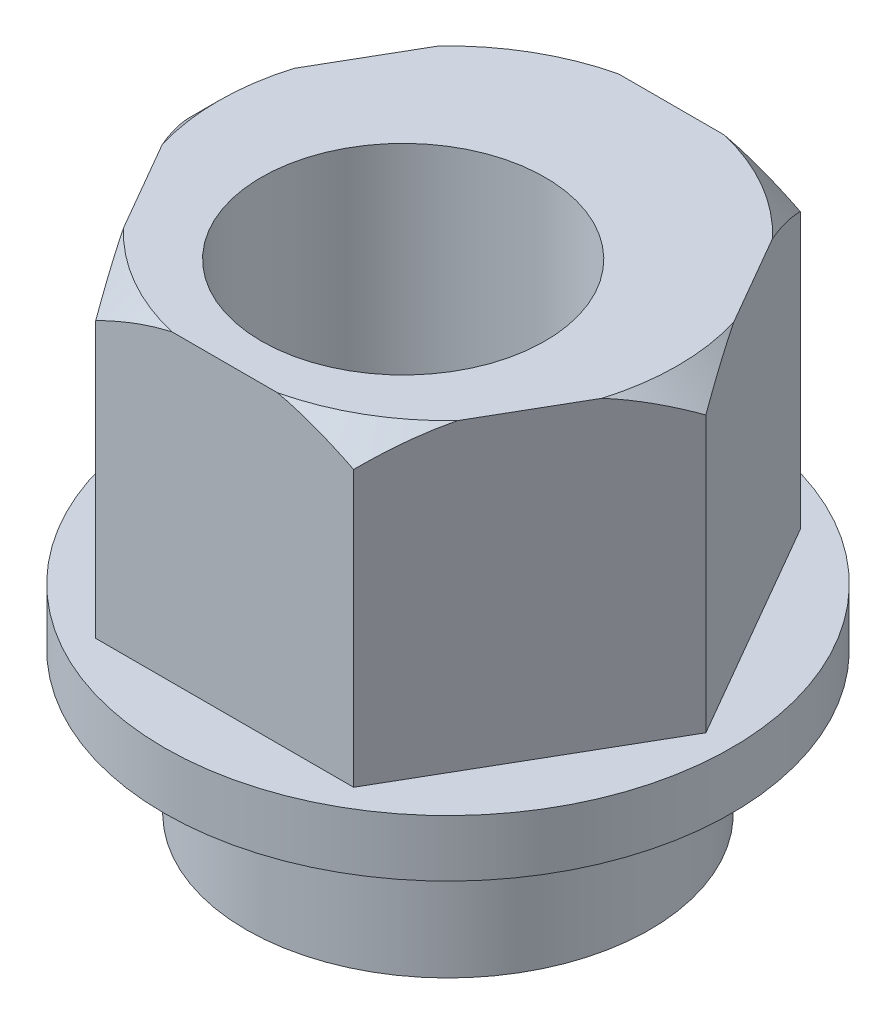
ISO-10303-21;
HEADER;
FILE_DESCRIPTION(('STEP AP214'),'2;1');
FILE_NAME('part.step','',(''),(''),'','','');
FILE_SCHEMA(('AUTOMOTIVE_DESIGN { 1 0 10303 214 1 1 1 1 }'));
ENDSEC;
DATA;
#1=APPLICATION_CONTEXT('core data for automotive mechanical design processes');
#2=APPLICATION_PROTOCOL_DEFINITION('international standard','automotive_design',2000,#1);
#3=PRODUCT_CONTEXT('',#1,'mechanical');
#4=PRODUCT('Part','Part','',(#3));
#5=PRODUCT_RELATED_PRODUCT_CATEGORY('part','',(#4));
#6=PRODUCT_DEFINITION_FORMATION('','',#4);
#7=PRODUCT_DEFINITION_CONTEXT('part definition',#1,'design');
#8=PRODUCT_DEFINITION('design','',#6,#7);
#9=PRODUCT_DEFINITION_SHAPE('','',#8);
#10=(LENGTH_UNIT() NAMED_UNIT(*) SI_UNIT(.MILLI.,.METRE.));
#11=(NAMED_UNIT(*) PLANE_ANGLE_UNIT() SI_UNIT($,.RADIAN.));
#12=(NAMED_UNIT(*) SI_UNIT($,.STERADIAN.) SOLID_ANGLE_UNIT());
#13=UNCERTAINTY_MEASURE_WITH_UNIT(LENGTH_MEASURE(1.E-05),#10,'distance_accuracy_value','');
#14=(GEOMETRIC_REPRESENTATION_CONTEXT(3) GLOBAL_UNCERTAINTY_ASSIGNED_CONTEXT((#13)) GLOBAL_UNIT_ASSIGNED_CONTEXT((#10,
#11,#12)) REPRESENTATION_CONTEXT('',''));
#15=CARTESIAN_POINT('',(0.,0.,0.));
#16=DIRECTION('',(0.,0.,1.));
#17=DIRECTION('',(1.,0.,0.));
#18=AXIS2_PLACEMENT_3D('',#15,#16,#17);
#19=CARTESIAN_POINT('',(0.,-1.,0.));
#20=DIRECTION('',(0.,1.,0.));
#21=DIRECTION('',(0.,0.,1.));
#22=AXIS2_PLACEMENT_3D('',#19,#20,#21);
#23=CYLINDRICAL_SURFACE('',#22,5.);
#24=CARTESIAN_POINT('',(0.,-1.,0.));
#25=DIRECTION('',(0.,1.,0.));
#26=DIRECTION('',(0.,0.,1.));
#27=AXIS2_PLACEMENT_3D('',#24,#25,#26);
#28=CIRCLE('',#27,5.);
#29=CARTESIAN_POINT('',(0.,-1.,5.));
#30=VERTEX_POINT('',#29);
#31=EDGE_CURVE('E162',#30,#30,#28,.T.);
#32=ORIENTED_EDGE('',*,*,#31,.T.);
#33=EDGE_LOOP('',(#32));
#34=FACE_BOUND('',#33,.T.);
#35=CARTESIAN_POINT('',(0.,0.,0.));
#36=DIRECTION('',(0.,1.,0.));
#37=DIRECTION('',(0.,0.,1.));
#38=AXIS2_PLACEMENT_3D('',#35,#36,#37);
#39=CIRCLE('',#38,5.);
#40=CARTESIAN_POINT('',(0.,0.,5.));
#41=VERTEX_POINT('',#40);
#42=EDGE_CURVE('E19',#41,#41,#39,.T.);
#43=ORIENTED_EDGE('',*,*,#42,.F.);
#44=EDGE_LOOP('',(#43));
#45=FACE_BOUND('',#44,.T.);
#46=ADVANCED_FACE('F16',(#34,#45),#23,.T.);
#47=CARTESIAN_POINT('',(0.,0.,0.));
#48=DIRECTION('',(0.,1.,0.));
#49=DIRECTION('',(0.,0.,1.));
#50=AXIS2_PLACEMENT_3D('',#47,#48,#49);
#51=PLANE('',#50);
#52=DIRECTION('',(-0.5,0.,0.866025403784439));
#53=VECTOR('',#52,1.);
#54=CARTESIAN_POINT('',(2.27187330926118,0.,3.935));
#55=LINE('',#54,#53);
#56=CARTESIAN_POINT('',(4.54374661852235,0.,0.));
#57=VERTEX_POINT('',#56);
#58=CARTESIAN_POINT('',(2.27187330926118,0.,3.935));
#59=VERTEX_POINT('',#58);
#60=EDGE_CURVE('E157',#57,#59,#55,.T.);
#61=ORIENTED_EDGE('',*,*,#60,.T.);
#62=DIRECTION('',(-1.,0.,0.));
#63=VECTOR('',#62,1.);
#64=CARTESIAN_POINT('',(-2.27187330926118,0.,3.935));
#65=LINE('',#64,#63);
#66=CARTESIAN_POINT('',(-2.27187330926118,0.,3.935));
#67=VERTEX_POINT('',#66);
#68=EDGE_CURVE('E110',#59,#67,#65,.T.);
#69=ORIENTED_EDGE('',*,*,#68,.T.);
#70=DIRECTION('',(-0.5,0.,-0.866025403784439));
#71=VECTOR('',#70,1.);
#72=CARTESIAN_POINT('',(-4.54374661852235,0.,0.));
#73=LINE('',#72,#71);
#74=CARTESIAN_POINT('',(-4.54374661852235,0.,0.));
#75=VERTEX_POINT('',#74);
#76=EDGE_CURVE('E130',#67,#75,#73,.T.);
#77=ORIENTED_EDGE('',*,*,#76,.T.);
#78=DIRECTION('',(0.5,0.,-0.866025403784439));
#79=VECTOR('',#78,1.);
#80=CARTESIAN_POINT('',(-2.27187330926118,0.,-3.935));
#81=LINE('',#80,#79);
#82=CARTESIAN_POINT('',(-2.27187330926118,0.,-3.935));
#83=VERTEX_POINT('',#82);
#84=EDGE_CURVE('E137',#75,#83,#81,.T.);
#85=ORIENTED_EDGE('',*,*,#84,.T.);
#86=DIRECTION('',(1.,0.,0.));
#87=VECTOR('',#86,1.);
#88=CARTESIAN_POINT('',(2.27187330926118,0.,-3.935));
#89=LINE('',#88,#87);
#90=CARTESIAN_POINT('',(2.27187330926118,0.,-3.935));
#91=VERTEX_POINT('',#90);
#92=EDGE_CURVE('E144',#83,#91,#89,.T.);
#93=ORIENTED_EDGE('',*,*,#92,.T.);
#94=DIRECTION('',(0.5,0.,0.866025403784438));
#95=VECTOR('',#94,1.);
#96=CARTESIAN_POINT('',(4.54374661852235,0.,0.));
#97=LINE('',#96,#95);
#98=EDGE_CURVE('E151',#91,#57,#97,.T.);
#99=ORIENTED_EDGE('',*,*,#98,.T.);
#100=EDGE_LOOP('',(#61,#69,#77,#85,#93,#99));
#101=FACE_BOUND('',#100,.T.);
#102=ORIENTED_EDGE('',*,*,#42,.T.);
#103=EDGE_LOOP('',(#102));
#104=FACE_BOUND('',#103,.T.);
#105=ADVANCED_FACE('F242',(#101,#104),#51,.T.);
#106=CARTESIAN_POINT('',(0.,-1.,0.));
#107=DIRECTION('',(0.,1.,0.));
#108=DIRECTION('',(0.,0.,1.));
#109=AXIS2_PLACEMENT_3D('',#106,#107,#108);
#110=PLANE('',#109);
#111=CARTESIAN_POINT('',(0.,-1.,0.));
#112=DIRECTION('',(0.,1.,0.));
#113=DIRECTION('',(0.,0.,1.));
#114=AXIS2_PLACEMENT_3D('',#111,#112,#113);
#115=CIRCLE('',#114,3.555);
#116=CARTESIAN_POINT('',(0.,-1.,3.555));
#117=VERTEX_POINT('',#116);
#118=EDGE_CURVE('E106',#117,#117,#115,.F.);
#119=ORIENTED_EDGE('',*,*,#118,.F.);
#120=EDGE_LOOP('',(#119));
#121=FACE_BOUND('',#120,.T.);
#122=ORIENTED_EDGE('',*,*,#31,.F.);
#123=EDGE_LOOP('',(#122));
#124=FACE_BOUND('',#123,.T.);
#125=ADVANCED_FACE('F224',(#121,#124),#110,.F.);
#126=CARTESIAN_POINT('',(0.,4.84699999998384,0.));
#127=DIRECTION('',(0.,-1.,0.));
#128=DIRECTION('',(0.,0.,-1.));
#129=AXIS2_PLACEMENT_3D('',#126,#127,#128);
#130=CONICAL_SURFACE('',#129,4.54674661853005,0.785398163397448);
#131=CARTESIAN_POINT('',(0.,5.35000000002128,0.));
#132=DIRECTION('',(0.,-1.,0.));
#133=DIRECTION('',(0.,0.,-1.));
#134=AXIS2_PLACEMENT_3D('',#131,#132,#133);
#135=CIRCLE('',#134,4.04374661849261);
#136=CARTESIAN_POINT('',(-2.94206815916331,5.35000000000688,2.77418846899851));
#137=VERTEX_POINT('',#136);
#138=CARTESIAN_POINT('',(-0.931483609456905,5.35000000000688,3.935));
#139=VERTEX_POINT('',#138);
#140=EDGE_CURVE('E100',#137,#139,#135,.F.);
#141=ORIENTED_EDGE('',*,*,#140,.F.);
#142=CARTESIAN_POINT('',(-2.94206815913204,5.34999999999247,2.77418846905266));
#143=CARTESIAN_POINT('',(-2.88369490561732,5.32311726281172,2.87529390994326));
#144=CARTESIAN_POINT('',(-2.82588978554609,5.2916876515457,2.97541531484424));
#145=CARTESIAN_POINT('',(-2.71168345432735,5.22111447069021,3.17322648306114));
#146=CARTESIAN_POINT('',(-2.65527804162325,5.1819982531219,3.27092352368655));
#147=CARTESIAN_POINT('',(-2.54376759125181,5.09725486990143,3.46406528930476));
#148=CARTESIAN_POINT('',(-2.48866169605256,5.05163214634154,3.55951149958642));
#149=CARTESIAN_POINT('',(-2.37946542423053,4.95475562364142,3.74864499037929));
#150=CARTESIAN_POINT('',(-2.32537928508143,4.90348264387568,3.84232493137076));
#151=CARTESIAN_POINT('',(-2.27187330926287,4.84999999999323,3.93499999999707));
#152=B_SPLINE_CURVE_WITH_KNOTS('',3,(#142,#143,#144,#145,#146,#147,#148,#149,#150,#151),
.UNSPECIFIED.,.F.,.F.,(4,2,2,2,4),(0.,0.359189297663674,0.717122874537991,1.07481324414615,
1.43375760013528),.UNSPECIFIED.);
#153=CARTESIAN_POINT('',(-2.27187330925948,4.84999999999238,3.935));
#154=VERTEX_POINT('',#153);
#155=EDGE_CURVE('E97',#137,#154,#152,.T.);
#156=ORIENTED_EDGE('',*,*,#155,.T.);
#157=CARTESIAN_POINT('',(-2.27187330925779,4.84999999999323,3.935));
#158=CARTESIAN_POINT('',(-2.16486135762066,4.90348264387568,3.935));
#159=CARTESIAN_POINT('',(-2.05668907932247,4.95475562364142,3.935));
#160=CARTESIAN_POINT('',(-1.8382965356784,5.05163214634154,3.935));
#161=CARTESIAN_POINT('',(-1.7280847452799,5.09725486990143,3.935));
#162=CARTESIAN_POINT('',(-1.50506384453703,5.1819982531219,3.935));
#163=CARTESIAN_POINT('',(-1.39225301912881,5.22111447069021,3.935));
#164=CARTESIAN_POINT('',(-1.16384035669133,5.2916876515457,3.935));
#165=CARTESIAN_POINT('',(-1.04823011654888,5.32311726281172,3.935));
#166=CARTESIAN_POINT('',(-0.931483609519434,5.34999999999247,3.935));
#167=B_SPLINE_CURVE_WITH_KNOTS('',3,(#157,#158,#159,#160,#161,#162,#163,#164,#165,#166),
.UNSPECIFIED.,.F.,.F.,(4,2,2,2,4),(0.,0.358944355989134,0.716634725597295,1.07456830247162,
1.43375760013529),.UNSPECIFIED.);
#168=EDGE_CURVE('E91',#154,#139,#167,.T.);
#169=ORIENTED_EDGE('',*,*,#168,.T.);
#170=EDGE_LOOP('',(#141,#156,#169));
#171=FACE_BOUND('',#170,.T.);
#172=ADVANCED_FACE('F108',(#171),#130,.T.);
#173=CARTESIAN_POINT('',(-2.27187330926118,5.35,3.935));
#174=DIRECTION('',(0.,0.,-1.));
#175=DIRECTION('',(-1.,0.,0.));
#176=AXIS2_PLACEMENT_3D('',#173,#174,#175);
#177=PLANE('',#176);
#178=CARTESIAN_POINT('',(0.931483609519689,5.34999999999242,3.935));
#179=CARTESIAN_POINT('',(1.04823011008447,5.32311726430012,3.935));
#180=CARTESIAN_POINT('',(1.16384034389687,5.29168765502345,3.935));
#181=CARTESIAN_POINT('',(1.39225299400288,5.22111447892625,3.935));
#182=CARTESIAN_POINT('',(1.50506381340808,5.18199826412198,3.935));
#183=CARTESIAN_POINT('',(1.72808470243914,5.09725488700998,3.935));
#184=CARTESIAN_POINT('',(1.8382964871284,5.0516321667935,3.935));
#185=CARTESIAN_POINT('',(2.0566890195489,4.95475565123795,3.935));
#186=CARTESIAN_POINT('',(2.16486129233428,4.90348267527638,3.935));
#187=CARTESIAN_POINT('',(2.27187323856476,4.85000003533974,3.935));
#188=B_SPLINE_CURVE_WITH_KNOTS('',3,(#178,#179,#180,#181,#182,#183,#184,#185,#186,#187),
.UNSPECIFIED.,.F.,.F.,(4,2,2,2,4),(0.,0.35918927780418,0.717122834985752,1.07481318494925,
1.43375752112754),.UNSPECIFIED.);
#189=CARTESIAN_POINT('',(0.931483609457033,5.35000000000685,3.935));
#190=VERTEX_POINT('',#189);
#191=CARTESIAN_POINT('',(2.27187327037482,4.85000001412749,3.93500000612825));
#192=VERTEX_POINT('',#191);
#193=EDGE_CURVE('E109',#190,#192,#188,.T.);
#194=ORIENTED_EDGE('',*,*,#193,.F.);
#195=DIRECTION('',(1.,0.,0.));
#196=VECTOR('',#195,1.);
#197=CARTESIAN_POINT('',(0.,5.35,3.935));
#198=LINE('',#197,#196);
#199=EDGE_CURVE('E102',#139,#190,#198,.T.);
#200=ORIENTED_EDGE('',*,*,#199,.F.);
#201=ORIENTED_EDGE('',*,*,#168,.F.);
#202=DIRECTION('',(0.,1.,0.));
#203=VECTOR('',#202,1.);
#204=CARTESIAN_POINT('',(-2.27187330926118,5.35,3.935));
#205=LINE('',#204,#203);
#206=EDGE_CURVE('E122',#154,#67,#205,.F.);
#207=ORIENTED_EDGE('',*,*,#206,.T.);
#208=ORIENTED_EDGE('',*,*,#68,.F.);
#209=DIRECTION('',(0.,1.,0.));
#210=VECTOR('',#209,1.);
#211=CARTESIAN_POINT('',(2.27187330926118,5.35,3.935));
#212=LINE('',#211,#210);
#213=EDGE_CURVE('E154',#59,#192,#212,.T.);
#214=ORIENTED_EDGE('',*,*,#213,.T.);
#215=EDGE_LOOP('',(#194,#200,#201,#207,#208,#214));
#216=FACE_BOUND('',#215,.T.);
#217=ADVANCED_FACE('F112',(#216),#177,.F.);
#218=CARTESIAN_POINT('',(0.,4.84699999998384,0.));
#219=DIRECTION('',(0.,-1.,0.));
#220=DIRECTION('',(0.,0.,-1.));
#221=AXIS2_PLACEMENT_3D('',#218,#219,#220);
#222=CONICAL_SURFACE('',#221,4.54674661853005,0.785398163397448);
#223=ORIENTED_EDGE('',*,*,#193,.T.);
#224=CARTESIAN_POINT('',(2.2718732790331,4.84999997949193,3.93499999113987));
#225=CARTESIAN_POINT('',(2.32537927035253,4.90348263289783,3.84232493481008));
#226=CARTESIAN_POINT('',(2.37946541625714,4.95475561705231,3.74864499825653));
#227=CARTESIAN_POINT('',(2.48866169377995,5.05163214384352,3.55951150943506));
#228=CARTESIAN_POINT('',(2.54376758795018,5.09725486712772,3.46406529671352));
#229=CARTESIAN_POINT('',(2.65527803812399,5.18199825072697,3.27092352805614));
#230=CARTESIAN_POINT('',(2.71168345165866,5.2211144689616,3.17322648683633));
#231=CARTESIAN_POINT('',(2.82588978463963,5.2916876510655,2.97541531726439));
#232=CARTESIAN_POINT('',(2.88369490564415,5.32311726290318,2.87529391159999));
#233=CARTESIAN_POINT('',(2.94206815913205,5.34999999999247,2.77418846905266));
#234=B_SPLINE_CURVE_WITH_KNOTS('',3,(#224,#225,#226,#227,#228,#229,#230,#231,#232,#233),
.UNSPECIFIED.,.F.,.F.,(4,2,2,2,4),(0.,0.358944360344127,0.716634733911905,1.07456831413734,
1.4337576156195),.UNSPECIFIED.);
#235=CARTESIAN_POINT('',(2.94206815916332,5.35000000000688,2.7741884689985));
#236=VERTEX_POINT('',#235);
#237=EDGE_CURVE('E156',#192,#236,#234,.T.);
#238=ORIENTED_EDGE('',*,*,#237,.T.);
#239=CARTESIAN_POINT('',(0.,5.35000000002128,0.));
#240=DIRECTION('',(0.,-1.,0.));
#241=DIRECTION('',(0.,0.,-1.));
#242=AXIS2_PLACEMENT_3D('',#239,#240,#241);
#243=CIRCLE('',#242,4.04374661849261);
#244=EDGE_CURVE('E115',#190,#236,#243,.F.);
#245=ORIENTED_EDGE('',*,*,#244,.F.);
#246=EDGE_LOOP('',(#223,#238,#245));
#247=FACE_BOUND('',#246,.T.);
#248=ADVANCED_FACE('F294',(#247),#222,.T.);
#249=CARTESIAN_POINT('',(2.27187330926118,5.35,3.935));
#250=DIRECTION('',(-0.866025403784439,0.,-0.5));
#251=DIRECTION('',(-0.5,0.,0.866025403784439));
#252=AXIS2_PLACEMENT_3D('',#249,#250,#251);
#253=PLANE('',#252);
#254=CARTESIAN_POINT('',(3.87355176865162,5.34999999999241,1.16081153094712));
#255=CARTESIAN_POINT('',(3.93192502216647,5.32311726281159,1.05970609005629));
#256=CARTESIAN_POINT('',(3.98973014223782,5.29168765154549,0.959584685155089));
#257=CARTESIAN_POINT('',(4.10393647345682,5.22111447068978,0.761773516937757));
#258=CARTESIAN_POINT('',(4.16034188616104,5.18199825312136,0.664076476312141));
#259=CARTESIAN_POINT('',(4.27185233653272,5.09725486990063,0.470934710693513));
#260=CARTESIAN_POINT('',(4.32695823173208,5.0516321463406,0.375488500411652));
#261=CARTESIAN_POINT('',(4.43615450355434,4.95475562364018,0.186355009618393));
#262=CARTESIAN_POINT('',(4.49024064270355,4.90348264387428,0.0926750686267245));
#263=CARTESIAN_POINT('',(4.54374661852222,4.84999999999166,2.30510402294371E-13));
#264=B_SPLINE_CURVE_WITH_KNOTS('',3,(#254,#255,#256,#257,#258,#259,#260,#261,#262,#263),
.UNSPECIFIED.,.F.,.F.,(4,2,2,2,4),(0.,0.359189297664486,0.717122874539609,1.07481324414857,
1.43375760013851),.UNSPECIFIED.);
#265=CARTESIAN_POINT('',(3.87355176862029,5.35000000000685,1.16081153100138));
#266=VERTEX_POINT('',#265);
#267=CARTESIAN_POINT('',(4.54374661852222,4.84999999999167,0.));
#268=VERTEX_POINT('',#267);
#269=EDGE_CURVE('E182',#266,#268,#264,.T.);
#270=ORIENTED_EDGE('',*,*,#269,.F.);
#271=DIRECTION('',(0.500000000000001,0.,-0.866025403784438));
#272=VECTOR('',#271,1.);
#273=CARTESIAN_POINT('',(2.94206815913,5.35,2.7741884690562));
#274=LINE('',#273,#272);
#275=EDGE_CURVE('E117',#236,#266,#274,.T.);
#276=ORIENTED_EDGE('',*,*,#275,.F.);
#277=ORIENTED_EDGE('',*,*,#237,.F.);
#278=ORIENTED_EDGE('',*,*,#213,.F.);
#279=ORIENTED_EDGE('',*,*,#60,.F.);
#280=DIRECTION('',(0.,1.,0.));
#281=VECTOR('',#280,1.);
#282=CARTESIAN_POINT('',(4.54374661852235,5.35,0.));
#283=LINE('',#282,#281);
#284=EDGE_CURVE('E147',#57,#268,#283,.T.);
#285=ORIENTED_EDGE('',*,*,#284,.T.);
#286=EDGE_LOOP('',(#270,#276,#277,#278,#279,#285));
#287=FACE_BOUND('',#286,.T.);
#288=ADVANCED_FACE('F300',(#287),#253,.F.);
#289=CARTESIAN_POINT('',(0.,4.84699999998384,0.));
#290=DIRECTION('',(0.,-1.,0.));
#291=DIRECTION('',(0.,0.,-1.));
#292=AXIS2_PLACEMENT_3D('',#289,#290,#291);
#293=CONICAL_SURFACE('',#292,4.54674661853005,0.785398163397448);
#294=CARTESIAN_POINT('',(0.,5.35000000002128,0.));
#295=DIRECTION('',(0.,-1.,0.));
#296=DIRECTION('',(0.,0.,-1.));
#297=AXIS2_PLACEMENT_3D('',#294,#295,#296);
#298=CIRCLE('',#297,4.04374661849261);
#299=CARTESIAN_POINT('',(3.87355176862022,5.35000000000688,-1.16081153100149));
#300=VERTEX_POINT('',#299);
#301=EDGE_CURVE('E202',#266,#300,#298,.F.);
#302=ORIENTED_EDGE('',*,*,#301,.F.);
#303=ORIENTED_EDGE('',*,*,#269,.T.);
#304=CARTESIAN_POINT('',(4.54374661852222,4.84999999999167,-2.30220451588973E-13));
#305=CARTESIAN_POINT('',(4.49024064270353,4.90348264387429,-0.0926750686267402));
#306=CARTESIAN_POINT('',(4.43615450355432,4.95475562364021,-0.186355009618426));
#307=CARTESIAN_POINT('',(4.32695823173203,5.05163214634064,-0.37548850041172));
#308=CARTESIAN_POINT('',(4.27185233653266,5.09725486990067,-0.470934710693599));
#309=CARTESIAN_POINT('',(4.16034188616097,5.18199825312141,-0.664076476312263));
#310=CARTESIAN_POINT('',(4.10393647345673,5.22111447068984,-0.761773516937897));
#311=CARTESIAN_POINT('',(3.98973014223772,5.29168765154555,-0.959584685155266));
#312=CARTESIAN_POINT('',(3.93192502216635,5.32311726281165,-1.05970609005649));
#313=CARTESIAN_POINT('',(3.87355176865149,5.34999999999248,-1.16081153094734));
#314=B_SPLINE_CURVE_WITH_KNOTS('',3,(#304,#305,#306,#307,#308,#309,#310,#311,#312,#313),
.UNSPECIFIED.,.F.,.F.,(4,2,2,2,4),(0.,0.358944355990006,0.716634725599032,1.07456830247422,
1.43375760013877),.UNSPECIFIED.);
#315=EDGE_CURVE('E150',#268,#300,#314,.T.);
#316=ORIENTED_EDGE('',*,*,#315,.T.);
#317=EDGE_LOOP('',(#302,#303,#316));
#318=FACE_BOUND('',#317,.T.);
#319=ADVANCED_FACE('F307',(#318),#293,.T.);
#320=CARTESIAN_POINT('',(4.54374661852235,5.35,0.));
#321=DIRECTION('',(-0.866025403784438,0.,0.5));
#322=DIRECTION('',(0.5,0.,0.866025403784438));
#323=AXIS2_PLACEMENT_3D('',#320,#321,#322);
#324=PLANE('',#323);
#325=CARTESIAN_POINT('',(2.94206815913191,5.34999999999242,-2.77418846905288));
#326=CARTESIAN_POINT('',(2.88369490561706,5.32311726281159,-2.87529390994371));
#327=CARTESIAN_POINT('',(2.8258897855457,5.29168765154549,-2.97541531484491));
#328=CARTESIAN_POINT('',(2.71168345432671,5.22111447068979,-3.17322648306224));
#329=CARTESIAN_POINT('',(2.65527804162249,5.18199825312136,-3.27092352368786));
#330=CARTESIAN_POINT('',(2.54376759125081,5.09725486990063,-3.46406528930649));
#331=CARTESIAN_POINT('',(2.48866169605145,5.0516321463406,-3.55951149958835));
#332=CARTESIAN_POINT('',(2.37946542422919,4.95475562364019,-3.74864499038161));
#333=CARTESIAN_POINT('',(2.32537928507998,4.90348264387428,-3.84232493137327));
#334=CARTESIAN_POINT('',(2.27187330926131,4.84999999999167,-3.93499999999977));
#335=B_SPLINE_CURVE_WITH_KNOTS('',3,(#325,#326,#327,#328,#329,#330,#331,#332,#333,#334),
.UNSPECIFIED.,.F.,.F.,(4,2,2,2,4),(0.,0.359189297664486,0.717122874539608,1.07481324414857,
1.43375760013851),.UNSPECIFIED.);
#336=CARTESIAN_POINT('',(2.94206815916324,5.35000000000685,-2.77418846899862));
#337=VERTEX_POINT('',#336);
#338=CARTESIAN_POINT('',(2.27187330926111,4.84999999999167,-3.93499999999988));
#339=VERTEX_POINT('',#338);
#340=EDGE_CURVE('E177',#337,#339,#335,.T.);
#341=ORIENTED_EDGE('',*,*,#340,.F.);
#342=DIRECTION('',(-0.500000000000001,0.,-0.866025403784438));
#343=VECTOR('',#342,1.);
#344=CARTESIAN_POINT('',(3.87355176865353,5.35,-1.1608115309438));
#345=LINE('',#344,#343);
#346=EDGE_CURVE('E201',#300,#337,#345,.T.);
#347=ORIENTED_EDGE('',*,*,#346,.F.);
#348=ORIENTED_EDGE('',*,*,#315,.F.);
#349=ORIENTED_EDGE('',*,*,#284,.F.);
#350=ORIENTED_EDGE('',*,*,#98,.F.);
#351=DIRECTION('',(0.,1.,0.));
#352=VECTOR('',#351,1.);
#353=CARTESIAN_POINT('',(2.27187330926118,5.35,-3.935));
#354=LINE('',#353,#352);
#355=EDGE_CURVE('E140',#91,#339,#354,.T.);
#356=ORIENTED_EDGE('',*,*,#355,.T.);
#357=EDGE_LOOP('',(#341,#347,#348,#349,#350,#356));
#358=FACE_BOUND('',#357,.T.);
#359=ADVANCED_FACE('F315',(#358),#324,.F.);
#360=CARTESIAN_POINT('',(0.,4.84699999998384,0.));
#361=DIRECTION('',(0.,-1.,0.));
#362=DIRECTION('',(0.,0.,-1.));
#363=AXIS2_PLACEMENT_3D('',#360,#361,#362);
#364=CONICAL_SURFACE('',#363,4.54674661853005,0.785398163397448);
#365=CARTESIAN_POINT('',(0.,5.35000000002128,0.));
#366=DIRECTION('',(0.,-1.,0.));
#367=DIRECTION('',(0.,0.,-1.));
#368=AXIS2_PLACEMENT_3D('',#365,#366,#367);
#369=CIRCLE('',#368,4.04374661849261);
#370=CARTESIAN_POINT('',(0.931483609456909,5.35000000000688,-3.935));
#371=VERTEX_POINT('',#370);
#372=EDGE_CURVE('E199',#337,#371,#369,.F.);
#373=ORIENTED_EDGE('',*,*,#372,.F.);
#374=ORIENTED_EDGE('',*,*,#340,.T.);
#375=CARTESIAN_POINT('',(2.27187330926091,4.84999999999167,-3.935));
#376=CARTESIAN_POINT('',(2.16486135762355,4.90348264387429,-3.935));
#377=CARTESIAN_POINT('',(2.05668907932511,4.9547556236402,-3.935));
#378=CARTESIAN_POINT('',(1.83829653568055,5.05163214634063,-3.935));
#379=CARTESIAN_POINT('',(1.7280847452818,5.09725486990067,-3.935));
#380=CARTESIAN_POINT('',(1.50506384453841,5.18199825312141,-3.935));
#381=CARTESIAN_POINT('',(1.39225301912993,5.22111447068984,-3.935));
#382=CARTESIAN_POINT('',(1.1638403566919,5.29168765154555,-3.935));
#383=CARTESIAN_POINT('',(1.04823011654917,5.32311726281165,-3.935));
#384=CARTESIAN_POINT('',(0.931483609519441,5.34999999999247,-3.935));
#385=B_SPLINE_CURVE_WITH_KNOTS('',3,(#375,#376,#377,#378,#379,#380,#381,#382,#383,#384),
.UNSPECIFIED.,.F.,.F.,(4,2,2,2,4),(0.,0.358944355990007,0.716634725599035,1.07456830247422,
1.43375760013878),.UNSPECIFIED.);
#386=EDGE_CURVE('E143',#339,#371,#385,.T.);
#387=ORIENTED_EDGE('',*,*,#386,.T.);
#388=EDGE_LOOP('',(#373,#374,#387));
#389=FACE_BOUND('',#388,.T.);
#390=ADVANCED_FACE('F323',(#389),#364,.T.);
#391=CARTESIAN_POINT('',(2.27187330926118,5.35,-3.935));
#392=DIRECTION('',(0.,0.,1.));
#393=DIRECTION('',(1.,0.,0.));
#394=AXIS2_PLACEMENT_3D('',#391,#392,#393);
#395=PLANE('',#394);
#396=CARTESIAN_POINT('',(-0.931483609519697,5.34999999999242,-3.935));
#397=CARTESIAN_POINT('',(-1.04823011654941,5.32311726281159,-3.935));
#398=CARTESIAN_POINT('',(-1.16384035669211,5.29168765154549,-3.935));
#399=CARTESIAN_POINT('',(-1.39225301913009,5.22111447068978,-3.935));
#400=CARTESIAN_POINT('',(-1.50506384453855,5.18199825312136,-3.935));
#401=CARTESIAN_POINT('',(-1.7280847452819,5.09725486990063,-3.935));
#402=CARTESIAN_POINT('',(-1.83829653568063,5.0516321463406,-3.935));
#403=CARTESIAN_POINT('',(-2.05668907932515,4.95475562364018,-3.935));
#404=CARTESIAN_POINT('',(-2.16486135762357,4.90348264387428,-3.935));
#405=CARTESIAN_POINT('',(-2.27187330926091,4.84999999999166,-3.935));
#406=B_SPLINE_CURVE_WITH_KNOTS('',3,(#396,#397,#398,#399,#400,#401,#402,#403,#404,#405),
.UNSPECIFIED.,.F.,.F.,(4,2,2,2,4),(0.,0.359189297664487,0.71712287453961,1.07481324414857,
1.43375760013852),.UNSPECIFIED.);
#407=CARTESIAN_POINT('',(-0.931483609457037,5.35000000000685,-3.935));
#408=VERTEX_POINT('',#407);
#409=CARTESIAN_POINT('',(-2.27187330926111,4.84999999999166,-3.93499999999988));
#410=VERTEX_POINT('',#409);
#411=EDGE_CURVE('E172',#408,#410,#406,.T.);
#412=ORIENTED_EDGE('',*,*,#411,.F.);
#413=DIRECTION('',(1.,0.,0.));
#414=VECTOR('',#413,1.);
#415=CARTESIAN_POINT('',(0.,5.35,-3.935));
#416=LINE('',#415,#414);
#417=EDGE_CURVE('E198',#371,#408,#416,.F.);
#418=ORIENTED_EDGE('',*,*,#417,.F.);
#419=ORIENTED_EDGE('',*,*,#386,.F.);
#420=ORIENTED_EDGE('',*,*,#355,.F.);
#421=ORIENTED_EDGE('',*,*,#92,.F.);
#422=DIRECTION('',(0.,1.,0.));
#423=VECTOR('',#422,1.);
#424=CARTESIAN_POINT('',(-2.27187330926118,5.35,-3.935));
#425=LINE('',#424,#423);
#426=EDGE_CURVE('E133',#83,#410,#425,.T.);
#427=ORIENTED_EDGE('',*,*,#426,.T.);
#428=EDGE_LOOP('',(#412,#418,#419,#420,#421,#427));
#429=FACE_BOUND('',#428,.T.);
#430=ADVANCED_FACE('F331',(#429),#395,.F.);
#431=CARTESIAN_POINT('',(0.,4.84699999998384,0.));
#432=DIRECTION('',(0.,-1.,0.));
#433=DIRECTION('',(0.,0.,-1.));
#434=AXIS2_PLACEMENT_3D('',#431,#432,#433);
#435=CONICAL_SURFACE('',#434,4.54674661853005,0.785398163397448);
#436=CARTESIAN_POINT('',(0.,5.35000000002128,0.));
#437=DIRECTION('',(0.,-1.,0.));
#438=DIRECTION('',(0.,0.,-1.));
#439=AXIS2_PLACEMENT_3D('',#436,#437,#438);
#440=CIRCLE('',#439,4.04374661849261);
#441=CARTESIAN_POINT('',(-2.94206815916332,5.35000000000688,-2.7741884689985));
#442=VERTEX_POINT('',#441);
#443=EDGE_CURVE('E196',#408,#442,#440,.F.);
#444=ORIENTED_EDGE('',*,*,#443,.F.);
#445=ORIENTED_EDGE('',*,*,#411,.T.);
#446=CARTESIAN_POINT('',(-2.27187330926131,4.84999999999166,-3.93499999999977));
#447=CARTESIAN_POINT('',(-2.32537928508,4.90348264387429,-3.84232493137326));
#448=CARTESIAN_POINT('',(-2.37946542422921,4.9547556236402,-3.74864499038157));
#449=CARTESIAN_POINT('',(-2.4886616960515,5.05163214634063,-3.55951149958828));
#450=CARTESIAN_POINT('',(-2.54376759125087,5.09725486990067,-3.4640652893064));
#451=CARTESIAN_POINT('',(-2.65527804162256,5.18199825312141,-3.27092352368774));
#452=CARTESIAN_POINT('',(-2.7116834543268,5.22111447068984,-3.1732264830621));
#453=CARTESIAN_POINT('',(-2.82588978554582,5.29168765154555,-2.97541531484473));
#454=CARTESIAN_POINT('',(-2.88369490561718,5.32311726281165,-2.87529390994351));
#455=CARTESIAN_POINT('',(-2.94206815913205,5.34999999999247,-2.77418846905266));
#456=B_SPLINE_CURVE_WITH_KNOTS('',3,(#446,#447,#448,#449,#450,#451,#452,#453,#454,#455),
.UNSPECIFIED.,.F.,.F.,(4,2,2,2,4),(0.,0.358944355990006,0.716634725599032,1.07456830247422,
1.43375760013877),.UNSPECIFIED.);
#457=EDGE_CURVE('E136',#410,#442,#456,.T.);
#458=ORIENTED_EDGE('',*,*,#457,.T.);
#459=EDGE_LOOP('',(#444,#445,#458));
#460=FACE_BOUND('',#459,.T.);
#461=ADVANCED_FACE('F339',(#460),#435,.T.);
#462=CARTESIAN_POINT('',(-2.27187330926118,5.35,-3.935));
#463=DIRECTION('',(0.866025403784439,0.,0.5));
#464=DIRECTION('',(0.5,0.,-0.866025403784439));
#465=AXIS2_PLACEMENT_3D('',#462,#463,#464);
#466=PLANE('',#465);
#467=CARTESIAN_POINT('',(-3.87355176865162,5.34999999999241,-1.16081153094712));
#468=CARTESIAN_POINT('',(-3.93192502216647,5.32311726281159,-1.05970609005629));
#469=CARTESIAN_POINT('',(-3.98973014223782,5.29168765154549,-0.959584685155089));
#470=CARTESIAN_POINT('',(-4.10393647345682,5.22111447068978,-0.761773516937757));
#471=CARTESIAN_POINT('',(-4.16034188616104,5.18199825312136,-0.664076476312142));
#472=CARTESIAN_POINT('',(-4.27185233653272,5.09725486990063,-0.470934710693514));
#473=CARTESIAN_POINT('',(-4.32695823173208,5.0516321463406,-0.375488500411653));
#474=CARTESIAN_POINT('',(-4.43615450355434,4.95475562364018,-0.186355009618394));
#475=CARTESIAN_POINT('',(-4.49024064270355,4.90348264387428,-0.0926750686267255));
#476=CARTESIAN_POINT('',(-4.54374661852222,4.84999999999166,-2.32325884659746E-13));
#477=B_SPLINE_CURVE_WITH_KNOTS('',3,(#467,#468,#469,#470,#471,#472,#473,#474,#475,#476),
.UNSPECIFIED.,.F.,.F.,(4,2,2,2,4),(0.,0.359189297664486,0.717122874539607,1.07481324414857,
1.43375760013851),.UNSPECIFIED.);
#478=CARTESIAN_POINT('',(-3.87355176862029,5.35000000000685,-1.16081153100138));
#479=VERTEX_POINT('',#478);
#480=CARTESIAN_POINT('',(-4.54374661852222,4.84999999999167,0.));
#481=VERTEX_POINT('',#480);
#482=EDGE_CURVE('E167',#479,#481,#477,.T.);
#483=ORIENTED_EDGE('',*,*,#482,.F.);
#484=DIRECTION('',(-0.500000000000001,0.,0.866025403784438));
#485=VECTOR('',#484,1.);
#486=CARTESIAN_POINT('',(-2.94206815913,5.35,-2.7741884690562));
#487=LINE('',#486,#485);
#488=EDGE_CURVE('E195',#442,#479,#487,.T.);
#489=ORIENTED_EDGE('',*,*,#488,.F.);
#490=ORIENTED_EDGE('',*,*,#457,.F.);
#491=ORIENTED_EDGE('',*,*,#426,.F.);
#492=ORIENTED_EDGE('',*,*,#84,.F.);
#493=DIRECTION('',(0.,1.,0.));
#494=VECTOR('',#493,1.);
#495=CARTESIAN_POINT('',(-4.54374661852235,5.35,0.));
#496=LINE('',#495,#494);
#497=EDGE_CURVE('E126',#75,#481,#496,.T.);
#498=ORIENTED_EDGE('',*,*,#497,.T.);
#499=EDGE_LOOP('',(#483,#489,#490,#491,#492,#498));
#500=FACE_BOUND('',#499,.T.);
#501=ADVANCED_FACE('F347',(#500),#466,.F.);
#502=CARTESIAN_POINT('',(0.,4.84699999998384,0.));
#503=DIRECTION('',(0.,-1.,0.));
#504=DIRECTION('',(0.,0.,-1.));
#505=AXIS2_PLACEMENT_3D('',#502,#503,#504);
#506=CONICAL_SURFACE('',#505,4.54674661853005,0.785398163397448);
#507=CARTESIAN_POINT('',(0.,5.35000000002128,0.));
#508=DIRECTION('',(0.,-1.,0.));
#509=DIRECTION('',(0.,0.,-1.));
#510=AXIS2_PLACEMENT_3D('',#507,#508,#509);
#511=CIRCLE('',#510,4.04374661849261);
#512=CARTESIAN_POINT('',(-3.87355176862021,5.35000000000688,1.16081153100151));
#513=VERTEX_POINT('',#512);
#514=EDGE_CURVE('E34',#479,#513,#511,.F.);
#515=ORIENTED_EDGE('',*,*,#514,.F.);
#516=ORIENTED_EDGE('',*,*,#482,.T.);
#517=CARTESIAN_POINT('',(-4.54374661852222,4.84999999999167,2.29072493639319E-13));
#518=CARTESIAN_POINT('',(-4.49024064270353,4.90348264387429,0.0926750686267397));
#519=CARTESIAN_POINT('',(-4.43615450355432,4.95475562364021,0.186355009618426));
#520=CARTESIAN_POINT('',(-4.32695823173203,5.05163214634064,0.375488500411722));
#521=CARTESIAN_POINT('',(-4.27185233653266,5.09725486990067,0.470934710693602));
#522=CARTESIAN_POINT('',(-4.16034188616096,5.18199825312141,0.664076476312268));
#523=CARTESIAN_POINT('',(-4.10393647345673,5.22111447068984,0.761773516937902));
#524=CARTESIAN_POINT('',(-3.98973014223771,5.29168765154555,0.959584685155273));
#525=CARTESIAN_POINT('',(-3.93192502216635,5.32311726281166,1.0597060900565));
#526=CARTESIAN_POINT('',(-3.87355176865148,5.34999999999248,1.16081153094734));
#527=B_SPLINE_CURVE_WITH_KNOTS('',3,(#517,#518,#519,#520,#521,#522,#523,#524,#525,#526),
.UNSPECIFIED.,.F.,.F.,(4,2,2,2,4),(0.,0.358944355990009,0.716634725599038,1.07456830247423,
1.43375760013878),.UNSPECIFIED.);
#528=EDGE_CURVE('E129',#481,#513,#527,.T.);
#529=ORIENTED_EDGE('',*,*,#528,.T.);
#530=EDGE_LOOP('',(#515,#516,#529));
#531=FACE_BOUND('',#530,.T.);
#532=ADVANCED_FACE('F271',(#531),#506,.T.);
#533=CARTESIAN_POINT('',(-4.54374661852235,5.35,0.));
#534=DIRECTION('',(0.866025403784439,0.,-0.5));
#535=DIRECTION('',(-0.5,0.,-0.866025403784439));
#536=AXIS2_PLACEMENT_3D('',#533,#534,#535);
#537=PLANE('',#536);
#538=ORIENTED_EDGE('',*,*,#155,.F.);
#539=DIRECTION('',(0.500000000000003,0.,0.866025403784437));
#540=VECTOR('',#539,1.);
#541=CARTESIAN_POINT('',(-3.87355176865353,5.35,1.16081153094381));
#542=LINE('',#541,#540);
#543=EDGE_CURVE('E104',#513,#137,#542,.T.);
#544=ORIENTED_EDGE('',*,*,#543,.F.);
#545=ORIENTED_EDGE('',*,*,#528,.F.);
#546=ORIENTED_EDGE('',*,*,#497,.F.);
#547=ORIENTED_EDGE('',*,*,#76,.F.);
#548=ORIENTED_EDGE('',*,*,#206,.F.);
#549=EDGE_LOOP('',(#538,#544,#545,#546,#547,#548));
#550=FACE_BOUND('',#549,.T.);
#551=ADVANCED_FACE('F217',(#550),#537,.F.);
#552=CARTESIAN_POINT('',(0.,-3.5,0.));
#553=DIRECTION('',(0.,1.,0.));
#554=DIRECTION('',(0.,0.,1.));
#555=AXIS2_PLACEMENT_3D('',#552,#553,#554);
#556=CYLINDRICAL_SURFACE('',#555,3.555);
#557=CARTESIAN_POINT('',(0.,-3.5,0.));
#558=DIRECTION('',(0.,1.,0.));
#559=DIRECTION('',(0.,0.,1.));
#560=AXIS2_PLACEMENT_3D('',#557,#558,#559);
#561=CIRCLE('',#560,3.555);
#562=CARTESIAN_POINT('',(0.,-3.5,3.555));
#563=VERTEX_POINT('',#562);
#564=EDGE_CURVE('E191',#563,#563,#561,.F.);
#565=ORIENTED_EDGE('',*,*,#564,.F.);
#566=EDGE_LOOP('',(#565));
#567=FACE_BOUND('',#566,.T.);
#568=ORIENTED_EDGE('',*,*,#118,.T.);
#569=EDGE_LOOP('',(#568));
#570=FACE_BOUND('',#569,.T.);
#571=ADVANCED_FACE('F264',(#567,#570),#556,.T.);
#572=CARTESIAN_POINT('',(0.,5.35,0.));
#573=DIRECTION('',(0.,1.,0.));
#574=DIRECTION('',(0.,0.,1.));
#575=AXIS2_PLACEMENT_3D('',#572,#573,#574);
#576=PLANE('',#575);
#577=CARTESIAN_POINT('',(0.,5.35,0.79));
#578=DIRECTION('',(0.,1.,0.));
#579=DIRECTION('',(0.,0.,1.));
#580=AXIS2_PLACEMENT_3D('',#577,#578,#579);
#581=CIRCLE('',#580,2.5);
#582=CARTESIAN_POINT('',(0.,5.35,3.29));
#583=VERTEX_POINT('',#582);
#584=EDGE_CURVE('E25',#583,#583,#581,.F.);
#585=ORIENTED_EDGE('',*,*,#584,.T.);
#586=EDGE_LOOP('',(#585));
#587=FACE_BOUND('',#586,.T.);
#588=ORIENTED_EDGE('',*,*,#514,.T.);
#589=ORIENTED_EDGE('',*,*,#543,.T.);
#590=ORIENTED_EDGE('',*,*,#140,.T.);
#591=ORIENTED_EDGE('',*,*,#199,.T.);
#592=ORIENTED_EDGE('',*,*,#244,.T.);
#593=ORIENTED_EDGE('',*,*,#275,.T.);
#594=ORIENTED_EDGE('',*,*,#301,.T.);
#595=ORIENTED_EDGE('',*,*,#346,.T.);
#596=ORIENTED_EDGE('',*,*,#372,.T.);
#597=ORIENTED_EDGE('',*,*,#417,.T.);
#598=ORIENTED_EDGE('',*,*,#443,.T.);
#599=ORIENTED_EDGE('',*,*,#488,.T.);
#600=EDGE_LOOP('',(#588,#589,#590,#591,#592,#593,#594,#595,#596,#597,#598,#599));
#601=FACE_BOUND('',#600,.T.);
#602=ADVANCED_FACE('F101',(#587,#601),#576,.T.);
#603=CARTESIAN_POINT('',(0.,-3.5,0.));
#604=DIRECTION('',(0.,-1.,0.));
#605=DIRECTION('',(0.,0.,-1.));
#606=AXIS2_PLACEMENT_3D('',#603,#604,#605);
#607=PLANE('',#606);
#608=CARTESIAN_POINT('',(0.,-3.5,0.79));
#609=DIRECTION('',(0.,1.,0.));
#610=DIRECTION('',(0.,0.,1.));
#611=AXIS2_PLACEMENT_3D('',#608,#609,#610);
#612=CIRCLE('',#611,2.5);
#613=CARTESIAN_POINT('',(0.,-3.5,3.29));
#614=VERTEX_POINT('',#613);
#615=EDGE_CURVE('E11',#614,#614,#612,.T.);
#616=ORIENTED_EDGE('',*,*,#615,.T.);
#617=EDGE_LOOP('',(#616));
#618=FACE_BOUND('',#617,.T.);
#619=ORIENTED_EDGE('',*,*,#564,.T.);
#620=EDGE_LOOP('',(#619));
#621=FACE_BOUND('',#620,.T.);
#622=ADVANCED_FACE('F252',(#618,#621),#607,.T.);
#623=CARTESIAN_POINT('',(0.,-3.5,0.79));
#624=DIRECTION('',(0.,1.,0.));
#625=DIRECTION('',(0.,0.,1.));
#626=AXIS2_PLACEMENT_3D('',#623,#624,#625);
#627=CYLINDRICAL_SURFACE('',#626,2.5);
#628=ORIENTED_EDGE('',*,*,#584,.F.);
#629=EDGE_LOOP('',(#628));
#630=FACE_BOUND('',#629,.T.);
#631=ORIENTED_EDGE('',*,*,#615,.F.);
#632=EDGE_LOOP('',(#631));
#633=FACE_BOUND('',#632,.T.);
#634=ADVANCED_FACE('F250',(#630,#633),#627,.F.);
#635=CLOSED_SHELL('',(#46,#105,#125,#172,#217,#248,#288,#319,#359,#390,#430,#461,#501,#532,#551,
#571,#602,#622,#634));
#636=MANIFOLD_SOLID_BREP('B1',#635);
#637=ADVANCED_BREP_SHAPE_REPRESENTATION('',(#18,#636),#14);
#638=SHAPE_DEFINITION_REPRESENTATION(#9,#637);
ENDSEC;
END-ISO-10303-21;
